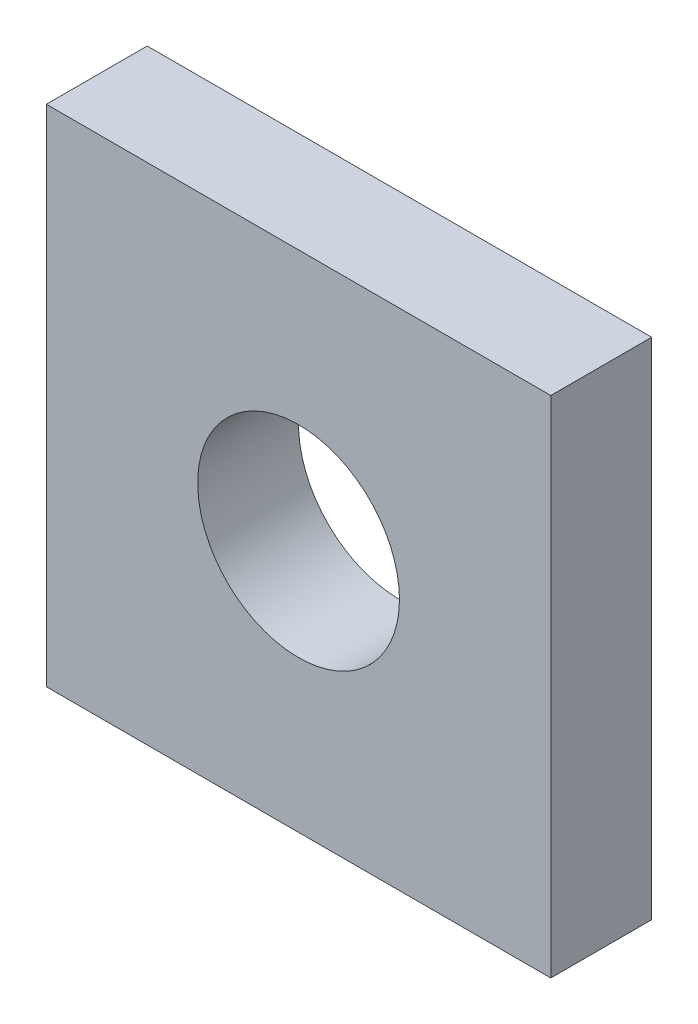
ISO-10303-21;
HEADER;
FILE_DESCRIPTION(('STEP AP214'),'2;1');
FILE_NAME('part.step','',(''),(''),'','','');
FILE_SCHEMA(('AUTOMOTIVE_DESIGN { 1 0 10303 214 1 1 1 1 }'));
ENDSEC;
DATA;
#1=APPLICATION_CONTEXT('core data for automotive mechanical design processes');
#2=APPLICATION_PROTOCOL_DEFINITION('international standard','automotive_design',2000,#1);
#3=PRODUCT_CONTEXT('',#1,'mechanical');
#4=PRODUCT('Part','Part','',(#3));
#5=PRODUCT_RELATED_PRODUCT_CATEGORY('part','',(#4));
#6=PRODUCT_DEFINITION_FORMATION('','',#4);
#7=PRODUCT_DEFINITION_CONTEXT('part definition',#1,'design');
#8=PRODUCT_DEFINITION('design','',#6,#7);
#9=PRODUCT_DEFINITION_SHAPE('','',#8);
#10=(LENGTH_UNIT() NAMED_UNIT(*) SI_UNIT(.MILLI.,.METRE.));
#11=(NAMED_UNIT(*) PLANE_ANGLE_UNIT() SI_UNIT($,.RADIAN.));
#12=(NAMED_UNIT(*) SI_UNIT($,.STERADIAN.) SOLID_ANGLE_UNIT());
#13=UNCERTAINTY_MEASURE_WITH_UNIT(LENGTH_MEASURE(1.E-05),#10,'distance_accuracy_value','');
#14=(GEOMETRIC_REPRESENTATION_CONTEXT(3) GLOBAL_UNCERTAINTY_ASSIGNED_CONTEXT((#13)) GLOBAL_UNIT_ASSIGNED_CONTEXT((#10,
#11,#12)) REPRESENTATION_CONTEXT('',''));
#15=CARTESIAN_POINT('',(0.,0.,0.));
#16=DIRECTION('',(0.,0.,1.));
#17=DIRECTION('',(1.,0.,0.));
#18=AXIS2_PLACEMENT_3D('',#15,#16,#17);
#19=CARTESIAN_POINT('',(250.,-250.,100.));
#20=DIRECTION('',(-1.,0.,0.));
#21=DIRECTION('',(0.,0.,1.));
#22=AXIS2_PLACEMENT_3D('',#19,#20,#21);
#23=PLANE('',#22);
#24=DIRECTION('',(0.,1.,0.));
#25=VECTOR('',#24,1.);
#26=CARTESIAN_POINT('',(250.,-250.,0.));
#27=LINE('',#26,#25);
#28=CARTESIAN_POINT('',(250.,-250.,0.));
#29=VERTEX_POINT('',#28);
#30=CARTESIAN_POINT('',(250.,250.,0.));
#31=VERTEX_POINT('',#30);
#32=EDGE_CURVE('E104',#29,#31,#27,.T.);
#33=ORIENTED_EDGE('',*,*,#32,.T.);
#34=DIRECTION('',(0.,0.,-1.));
#35=VECTOR('',#34,1.);
#36=CARTESIAN_POINT('',(250.,250.,100.));
#37=LINE('',#36,#35);
#38=CARTESIAN_POINT('',(250.,250.,100.));
#39=VERTEX_POINT('',#38);
#40=EDGE_CURVE('E11',#39,#31,#37,.T.);
#41=ORIENTED_EDGE('',*,*,#40,.F.);
#42=DIRECTION('',(0.,1.,0.));
#43=VECTOR('',#42,1.);
#44=CARTESIAN_POINT('',(250.,-250.,100.));
#45=LINE('',#44,#43);
#46=CARTESIAN_POINT('',(250.,-250.,100.));
#47=VERTEX_POINT('',#46);
#48=EDGE_CURVE('E92',#47,#39,#45,.T.);
#49=ORIENTED_EDGE('',*,*,#48,.F.);
#50=DIRECTION('',(0.,0.,-1.));
#51=VECTOR('',#50,1.);
#52=CARTESIAN_POINT('',(250.,-250.,100.));
#53=LINE('',#52,#51);
#54=EDGE_CURVE('E100',#47,#29,#53,.T.);
#55=ORIENTED_EDGE('',*,*,#54,.T.);
#56=EDGE_LOOP('',(#33,#41,#49,#55));
#57=FACE_BOUND('',#56,.T.);
#58=ADVANCED_FACE('F41',(#57),#23,.F.);
#59=CARTESIAN_POINT('',(-250.,250.,100.));
#60=DIRECTION('',(0.,-1.,0.));
#61=DIRECTION('',(0.,0.,-1.));
#62=AXIS2_PLACEMENT_3D('',#59,#60,#61);
#63=PLANE('',#62);
#64=DIRECTION('',(-1.,0.,0.));
#65=VECTOR('',#64,1.);
#66=CARTESIAN_POINT('',(-250.,250.,0.));
#67=LINE('',#66,#65);
#68=CARTESIAN_POINT('',(-250.,250.,0.));
#69=VERTEX_POINT('',#68);
#70=EDGE_CURVE('E96',#31,#69,#67,.T.);
#71=ORIENTED_EDGE('',*,*,#70,.T.);
#72=DIRECTION('',(0.,0.,-1.));
#73=VECTOR('',#72,1.);
#74=CARTESIAN_POINT('',(-250.,250.,100.));
#75=LINE('',#74,#73);
#76=CARTESIAN_POINT('',(-250.,250.,100.));
#77=VERTEX_POINT('',#76);
#78=EDGE_CURVE('E49',#77,#69,#75,.T.);
#79=ORIENTED_EDGE('',*,*,#78,.F.);
#80=DIRECTION('',(-1.,0.,0.));
#81=VECTOR('',#80,1.);
#82=CARTESIAN_POINT('',(-250.,250.,100.));
#83=LINE('',#82,#81);
#84=EDGE_CURVE('E87',#39,#77,#83,.T.);
#85=ORIENTED_EDGE('',*,*,#84,.F.);
#86=ORIENTED_EDGE('',*,*,#40,.T.);
#87=EDGE_LOOP('',(#71,#79,#85,#86));
#88=FACE_BOUND('',#87,.T.);
#89=ADVANCED_FACE('F95',(#88),#63,.F.);
#90=CARTESIAN_POINT('',(-250.,-250.,100.));
#91=DIRECTION('',(1.,0.,0.));
#92=DIRECTION('',(0.,0.,-1.));
#93=AXIS2_PLACEMENT_3D('',#90,#91,#92);
#94=PLANE('',#93);
#95=DIRECTION('',(0.,-1.,0.));
#96=VECTOR('',#95,1.);
#97=CARTESIAN_POINT('',(-250.,-250.,0.));
#98=LINE('',#97,#96);
#99=CARTESIAN_POINT('',(-250.,-250.,0.));
#100=VERTEX_POINT('',#99);
#101=EDGE_CURVE('E74',#69,#100,#98,.T.);
#102=ORIENTED_EDGE('',*,*,#101,.T.);
#103=DIRECTION('',(0.,0.,-1.));
#104=VECTOR('',#103,1.);
#105=CARTESIAN_POINT('',(-250.,-250.,100.));
#106=LINE('',#105,#104);
#107=CARTESIAN_POINT('',(-250.,-250.,100.));
#108=VERTEX_POINT('',#107);
#109=EDGE_CURVE('E97',#108,#100,#106,.T.);
#110=ORIENTED_EDGE('',*,*,#109,.F.);
#111=DIRECTION('',(0.,-1.,0.));
#112=VECTOR('',#111,1.);
#113=CARTESIAN_POINT('',(-250.,-250.,100.));
#114=LINE('',#113,#112);
#115=EDGE_CURVE('E90',#77,#108,#114,.T.);
#116=ORIENTED_EDGE('',*,*,#115,.F.);
#117=ORIENTED_EDGE('',*,*,#78,.T.);
#118=EDGE_LOOP('',(#102,#110,#116,#117));
#119=FACE_BOUND('',#118,.T.);
#120=ADVANCED_FACE('F98',(#119),#94,.F.);
#121=CARTESIAN_POINT('',(-250.,-250.,100.));
#122=DIRECTION('',(0.,1.,0.));
#123=DIRECTION('',(0.,0.,1.));
#124=AXIS2_PLACEMENT_3D('',#121,#122,#123);
#125=PLANE('',#124);
#126=DIRECTION('',(1.,0.,0.));
#127=VECTOR('',#126,1.);
#128=CARTESIAN_POINT('',(-250.,-250.,0.));
#129=LINE('',#128,#127);
#130=EDGE_CURVE('E80',#100,#29,#129,.T.);
#131=ORIENTED_EDGE('',*,*,#130,.T.);
#132=ORIENTED_EDGE('',*,*,#54,.F.);
#133=DIRECTION('',(1.,0.,0.));
#134=VECTOR('',#133,1.);
#135=CARTESIAN_POINT('',(-250.,-250.,100.));
#136=LINE('',#135,#134);
#137=EDGE_CURVE('E57',#108,#47,#136,.T.);
#138=ORIENTED_EDGE('',*,*,#137,.F.);
#139=ORIENTED_EDGE('',*,*,#109,.T.);
#140=EDGE_LOOP('',(#131,#132,#138,#139));
#141=FACE_BOUND('',#140,.T.);
#142=ADVANCED_FACE('F112',(#141),#125,.F.);
#143=CARTESIAN_POINT('',(0.,0.,100.));
#144=DIRECTION('',(0.,0.,-1.));
#145=DIRECTION('',(-1.,0.,0.));
#146=AXIS2_PLACEMENT_3D('',#143,#144,#145);
#147=PLANE('',#146);
#148=CARTESIAN_POINT('',(0.,0.,100.));
#149=DIRECTION('',(0.,0.,1.));
#150=DIRECTION('',(1.,0.,0.));
#151=AXIS2_PLACEMENT_3D('',#148,#149,#150);
#152=CIRCLE('',#151,100.);
#153=CARTESIAN_POINT('',(100.,0.,100.));
#154=VERTEX_POINT('',#153);
#155=EDGE_CURVE('E107',#154,#154,#152,.T.);
#156=ORIENTED_EDGE('',*,*,#155,.F.);
#157=EDGE_LOOP('',(#156));
#158=FACE_BOUND('',#157,.T.);
#159=ORIENTED_EDGE('',*,*,#48,.T.);
#160=ORIENTED_EDGE('',*,*,#84,.T.);
#161=ORIENTED_EDGE('',*,*,#115,.T.);
#162=ORIENTED_EDGE('',*,*,#137,.T.);
#163=EDGE_LOOP('',(#159,#160,#161,#162));
#164=FACE_BOUND('',#163,.T.);
#165=ADVANCED_FACE('F88',(#158,#164),#147,.F.);
#166=CARTESIAN_POINT('',(0.,0.,0.));
#167=DIRECTION('',(0.,0.,-1.));
#168=DIRECTION('',(-1.,0.,0.));
#169=AXIS2_PLACEMENT_3D('',#166,#167,#168);
#170=PLANE('',#169);
#171=CARTESIAN_POINT('',(0.,0.,0.));
#172=DIRECTION('',(0.,0.,1.));
#173=DIRECTION('',(1.,0.,0.));
#174=AXIS2_PLACEMENT_3D('',#171,#172,#173);
#175=CIRCLE('',#174,100.);
#176=CARTESIAN_POINT('',(100.,0.,0.));
#177=VERTEX_POINT('',#176);
#178=EDGE_CURVE('E118',#177,#177,#175,.T.);
#179=ORIENTED_EDGE('',*,*,#178,.T.);
#180=EDGE_LOOP('',(#179));
#181=FACE_BOUND('',#180,.T.);
#182=ORIENTED_EDGE('',*,*,#32,.F.);
#183=ORIENTED_EDGE('',*,*,#130,.F.);
#184=ORIENTED_EDGE('',*,*,#101,.F.);
#185=ORIENTED_EDGE('',*,*,#70,.F.);
#186=EDGE_LOOP('',(#182,#183,#184,#185));
#187=FACE_BOUND('',#186,.T.);
#188=ADVANCED_FACE('F115',(#181,#187),#170,.T.);
#189=CARTESIAN_POINT('',(0.,0.,100.));
#190=DIRECTION('',(0.,0.,-1.));
#191=DIRECTION('',(-1.,0.,0.));
#192=AXIS2_PLACEMENT_3D('',#189,#190,#191);
#193=CYLINDRICAL_SURFACE('',#192,100.);
#194=ORIENTED_EDGE('',*,*,#155,.T.);
#195=EDGE_LOOP('',(#194));
#196=FACE_BOUND('',#195,.T.);
#197=ORIENTED_EDGE('',*,*,#178,.F.);
#198=EDGE_LOOP('',(#197));
#199=FACE_BOUND('',#198,.T.);
#200=ADVANCED_FACE('F124',(#196,#199),#193,.F.);
#201=CLOSED_SHELL('',(#58,#89,#120,#142,#165,#188,#200));
#202=MANIFOLD_SOLID_BREP('B2',#201);
#203=ADVANCED_BREP_SHAPE_REPRESENTATION('',(#18,#202),#14);
#204=SHAPE_DEFINITION_REPRESENTATION(#9,#203);
ENDSEC;
END-ISO-10303-21;
